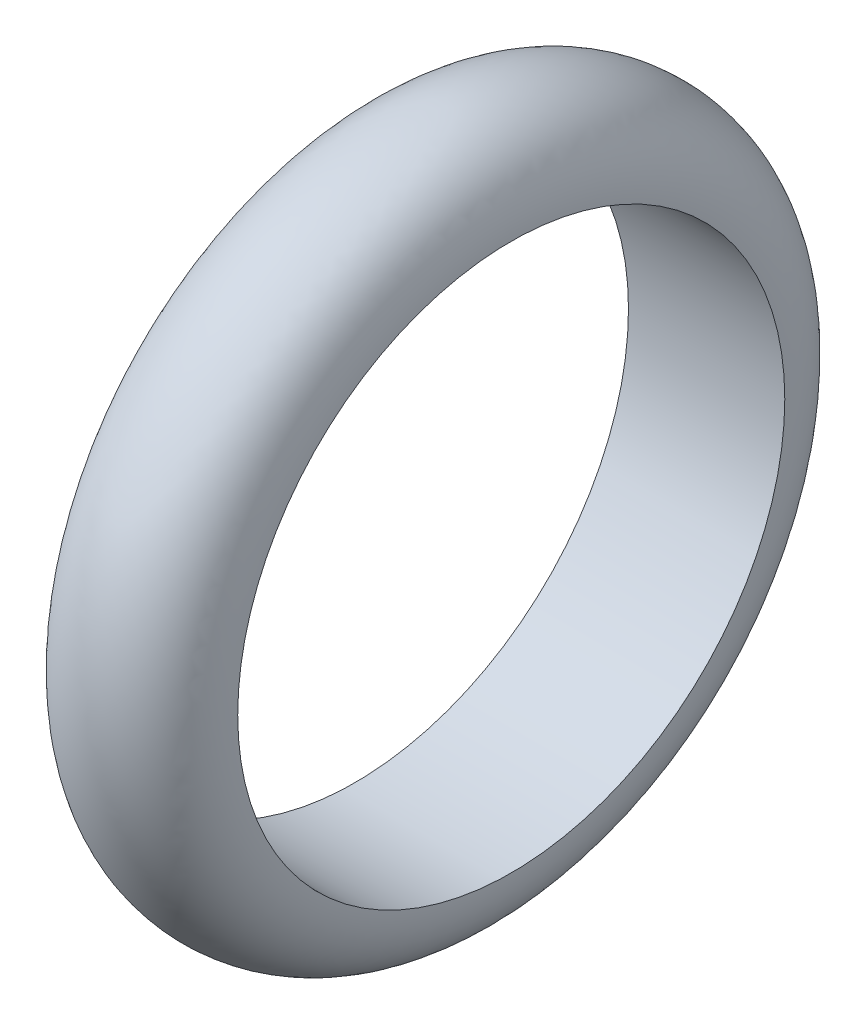
ISO-10303-21;
HEADER;
FILE_DESCRIPTION(('STEP AP214'),'2;1');
FILE_NAME('part.step','',(''),(''),'','','');
FILE_SCHEMA(('AUTOMOTIVE_DESIGN { 1 0 10303 214 1 1 1 1 }'));
ENDSEC;
DATA;
#1=APPLICATION_CONTEXT('core data for automotive mechanical design processes');
#2=APPLICATION_PROTOCOL_DEFINITION('international standard','automotive_design',2000,#1);
#3=PRODUCT_CONTEXT('',#1,'mechanical');
#4=PRODUCT('Part','Part','',(#3));
#5=PRODUCT_RELATED_PRODUCT_CATEGORY('part','',(#4));
#6=PRODUCT_DEFINITION_FORMATION('','',#4);
#7=PRODUCT_DEFINITION_CONTEXT('part definition',#1,'design');
#8=PRODUCT_DEFINITION('design','',#6,#7);
#9=PRODUCT_DEFINITION_SHAPE('','',#8);
#10=(LENGTH_UNIT() NAMED_UNIT(*) SI_UNIT(.MILLI.,.METRE.));
#11=(NAMED_UNIT(*) PLANE_ANGLE_UNIT() SI_UNIT($,.RADIAN.));
#12=(NAMED_UNIT(*) SI_UNIT($,.STERADIAN.) SOLID_ANGLE_UNIT());
#13=UNCERTAINTY_MEASURE_WITH_UNIT(LENGTH_MEASURE(1.E-05),#10,'distance_accuracy_value','');
#14=(GEOMETRIC_REPRESENTATION_CONTEXT(3) GLOBAL_UNCERTAINTY_ASSIGNED_CONTEXT((#13)) GLOBAL_UNIT_ASSIGNED_CONTEXT((#10,
#11,#12)) REPRESENTATION_CONTEXT('',''));
#15=CARTESIAN_POINT('',(0.,0.,0.));
#16=DIRECTION('',(0.,0.,1.));
#17=DIRECTION('',(1.,0.,0.));
#18=AXIS2_PLACEMENT_3D('',#15,#16,#17);
#19=CARTESIAN_POINT('',(25.4,0.,-44.45));
#20=CARTESIAN_POINT('',(25.4000000000001,0.,-61.6334213084334));
#21=CARTESIAN_POINT('',(0.,0.,-61.6334213084334));
#22=CARTESIAN_POINT('',(0.,0.,-44.45));
#23=B_SPLINE_CURVE_WITH_KNOTS('',3,(#19,#20,#21,#22),.UNSPECIFIED.,.F.,.F.,(4,4),(0.,1.),.UNSPECIFIED.);
#24=CARTESIAN_POINT('',(0.,0.,0.));
#25=DIRECTION('',(-1.,0.,0.));
#26=AXIS1_PLACEMENT('',#24,#25);
#27=SURFACE_OF_REVOLUTION('',#23,#26);
#28=CARTESIAN_POINT('',(0.,0.,0.));
#29=DIRECTION('',(-1.,0.,0.));
#30=DIRECTION('',(0.,0.,1.));
#31=AXIS2_PLACEMENT_3D('',#28,#29,#30);
#32=CIRCLE('',#31,44.45);
#33=CARTESIAN_POINT('',(0.,0.,44.45));
#34=VERTEX_POINT('',#33);
#35=EDGE_CURVE('E10',#34,#34,#32,.T.);
#36=ORIENTED_EDGE('',*,*,#35,.F.);
#37=EDGE_LOOP('',(#36));
#38=FACE_BOUND('',#37,.T.);
#39=CARTESIAN_POINT('',(25.4,0.,0.));
#40=DIRECTION('',(-1.,0.,0.));
#41=DIRECTION('',(0.,0.,1.));
#42=AXIS2_PLACEMENT_3D('',#39,#40,#41);
#43=CIRCLE('',#42,44.45);
#44=CARTESIAN_POINT('',(25.4,0.,44.45));
#45=VERTEX_POINT('',#44);
#46=EDGE_CURVE('E45',#45,#45,#43,.T.);
#47=ORIENTED_EDGE('',*,*,#46,.T.);
#48=EDGE_LOOP('',(#47));
#49=FACE_BOUND('',#48,.T.);
#50=ADVANCED_FACE('F37',(#38,#49),#27,.T.);
#51=CARTESIAN_POINT('',(0.,0.,0.));
#52=DIRECTION('',(-1.,0.,0.));
#53=DIRECTION('',(0.,0.,1.));
#54=AXIS2_PLACEMENT_3D('',#51,#52,#53);
#55=CYLINDRICAL_SURFACE('',#54,44.45);
#56=ORIENTED_EDGE('',*,*,#46,.F.);
#57=EDGE_LOOP('',(#56));
#58=FACE_BOUND('',#57,.T.);
#59=ORIENTED_EDGE('',*,*,#35,.T.);
#60=EDGE_LOOP('',(#59));
#61=FACE_BOUND('',#60,.T.);
#62=ADVANCED_FACE('F59',(#58,#61),#55,.F.);
#63=CLOSED_SHELL('',(#50,#62));
#64=MANIFOLD_SOLID_BREP('B2',#63);
#65=ADVANCED_BREP_SHAPE_REPRESENTATION('',(#18,#64),#14);
#66=SHAPE_DEFINITION_REPRESENTATION(#9,#65);
ENDSEC;
END-ISO-10303-21;
